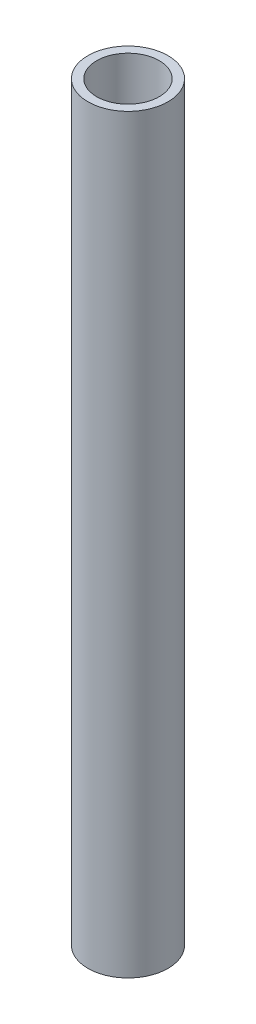
ISO-10303-21;
HEADER;
FILE_DESCRIPTION(('STEP AP214'),'2;1');
FILE_NAME('part.step','',(''),(''),'','','');
FILE_SCHEMA(('AUTOMOTIVE_DESIGN { 1 0 10303 214 1 1 1 1 }'));
ENDSEC;
DATA;
#1=APPLICATION_CONTEXT('core data for automotive mechanical design processes');
#2=APPLICATION_PROTOCOL_DEFINITION('international standard','automotive_design',2000,#1);
#3=PRODUCT_CONTEXT('',#1,'mechanical');
#4=PRODUCT('Part','Part','',(#3));
#5=PRODUCT_RELATED_PRODUCT_CATEGORY('part','',(#4));
#6=PRODUCT_DEFINITION_FORMATION('','',#4);
#7=PRODUCT_DEFINITION_CONTEXT('part definition',#1,'design');
#8=PRODUCT_DEFINITION('design','',#6,#7);
#9=PRODUCT_DEFINITION_SHAPE('','',#8);
#10=(LENGTH_UNIT() NAMED_UNIT(*) SI_UNIT(.MILLI.,.METRE.));
#11=(NAMED_UNIT(*) PLANE_ANGLE_UNIT() SI_UNIT($,.RADIAN.));
#12=(NAMED_UNIT(*) SI_UNIT($,.STERADIAN.) SOLID_ANGLE_UNIT());
#13=UNCERTAINTY_MEASURE_WITH_UNIT(LENGTH_MEASURE(1.E-05),#10,'distance_accuracy_value','');
#14=(GEOMETRIC_REPRESENTATION_CONTEXT(3) GLOBAL_UNCERTAINTY_ASSIGNED_CONTEXT((#13)) GLOBAL_UNIT_ASSIGNED_CONTEXT((#10,
#11,#12)) REPRESENTATION_CONTEXT('',''));
#15=CARTESIAN_POINT('',(0.,0.,0.));
#16=DIRECTION('',(0.,0.,1.));
#17=DIRECTION('',(1.,0.,0.));
#18=AXIS2_PLACEMENT_3D('',#15,#16,#17);
#19=CARTESIAN_POINT('',(0.,300.,0.));
#20=DIRECTION('',(0.,1.,0.));
#21=DIRECTION('',(0.,0.,1.));
#22=AXIS2_PLACEMENT_3D('',#19,#20,#21);
#23=PLANE('',#22);
#24=CARTESIAN_POINT('',(0.,300.,0.));
#25=DIRECTION('',(0.,1.,0.));
#26=DIRECTION('',(0.,0.,1.));
#27=AXIS2_PLACEMENT_3D('',#24,#25,#26);
#28=CIRCLE('',#27,16.);
#29=CARTESIAN_POINT('',(0.,300.,16.));
#30=VERTEX_POINT('',#29);
#31=EDGE_CURVE('E10',#30,#30,#28,.T.);
#32=ORIENTED_EDGE('',*,*,#31,.T.);
#33=EDGE_LOOP('',(#32));
#34=FACE_BOUND('',#33,.T.);
#35=CARTESIAN_POINT('',(0.,300.,0.));
#36=DIRECTION('',(0.,1.,0.));
#37=DIRECTION('',(0.,0.,1.));
#38=AXIS2_PLACEMENT_3D('',#35,#36,#37);
#39=CIRCLE('',#38,12.5);
#40=CARTESIAN_POINT('',(0.,300.,12.5));
#41=VERTEX_POINT('',#40);
#42=EDGE_CURVE('E39',#41,#41,#39,.T.);
#43=ORIENTED_EDGE('',*,*,#42,.F.);
#44=EDGE_LOOP('',(#43));
#45=FACE_BOUND('',#44,.T.);
#46=ADVANCED_FACE('F28',(#34,#45),#23,.T.);
#47=CARTESIAN_POINT('',(0.,0.,0.));
#48=DIRECTION('',(0.,1.,0.));
#49=DIRECTION('',(0.,0.,1.));
#50=AXIS2_PLACEMENT_3D('',#47,#48,#49);
#51=PLANE('',#50);
#52=CARTESIAN_POINT('',(0.,0.,0.));
#53=DIRECTION('',(0.,1.,0.));
#54=DIRECTION('',(0.,0.,1.));
#55=AXIS2_PLACEMENT_3D('',#52,#53,#54);
#56=CIRCLE('',#55,16.);
#57=CARTESIAN_POINT('',(0.,0.,16.));
#58=VERTEX_POINT('',#57);
#59=EDGE_CURVE('E32',#58,#58,#56,.T.);
#60=ORIENTED_EDGE('',*,*,#59,.F.);
#61=EDGE_LOOP('',(#60));
#62=FACE_BOUND('',#61,.T.);
#63=CARTESIAN_POINT('',(0.,0.,0.));
#64=DIRECTION('',(0.,1.,0.));
#65=DIRECTION('',(0.,0.,1.));
#66=AXIS2_PLACEMENT_3D('',#63,#64,#65);
#67=CIRCLE('',#66,12.5);
#68=CARTESIAN_POINT('',(0.,0.,12.5));
#69=VERTEX_POINT('',#68);
#70=EDGE_CURVE('E41',#69,#69,#67,.T.);
#71=ORIENTED_EDGE('',*,*,#70,.T.);
#72=EDGE_LOOP('',(#71));
#73=FACE_BOUND('',#72,.T.);
#74=ADVANCED_FACE('F51',(#62,#73),#51,.F.);
#75=CARTESIAN_POINT('',(0.,300.,0.));
#76=DIRECTION('',(0.,-1.,0.));
#77=DIRECTION('',(0.,0.,-1.));
#78=AXIS2_PLACEMENT_3D('',#75,#76,#77);
#79=CYLINDRICAL_SURFACE('',#78,16.);
#80=ORIENTED_EDGE('',*,*,#31,.F.);
#81=EDGE_LOOP('',(#80));
#82=FACE_BOUND('',#81,.T.);
#83=ORIENTED_EDGE('',*,*,#59,.T.);
#84=EDGE_LOOP('',(#83));
#85=FACE_BOUND('',#84,.T.);
#86=ADVANCED_FACE('F30',(#82,#85),#79,.T.);
#87=CARTESIAN_POINT('',(0.,300.,0.));
#88=DIRECTION('',(0.,-1.,0.));
#89=DIRECTION('',(0.,0.,-1.));
#90=AXIS2_PLACEMENT_3D('',#87,#88,#89);
#91=CYLINDRICAL_SURFACE('',#90,12.5);
#92=ORIENTED_EDGE('',*,*,#42,.T.);
#93=EDGE_LOOP('',(#92));
#94=FACE_BOUND('',#93,.T.);
#95=ORIENTED_EDGE('',*,*,#70,.F.);
#96=EDGE_LOOP('',(#95));
#97=FACE_BOUND('',#96,.T.);
#98=ADVANCED_FACE('F47',(#94,#97),#91,.F.);
#99=CLOSED_SHELL('',(#46,#74,#86,#98));
#100=MANIFOLD_SOLID_BREP('B2',#99);
#101=ADVANCED_BREP_SHAPE_REPRESENTATION('',(#18,#100),#14);
#102=SHAPE_DEFINITION_REPRESENTATION(#9,#101);
ENDSEC;
END-ISO-10303-21;
